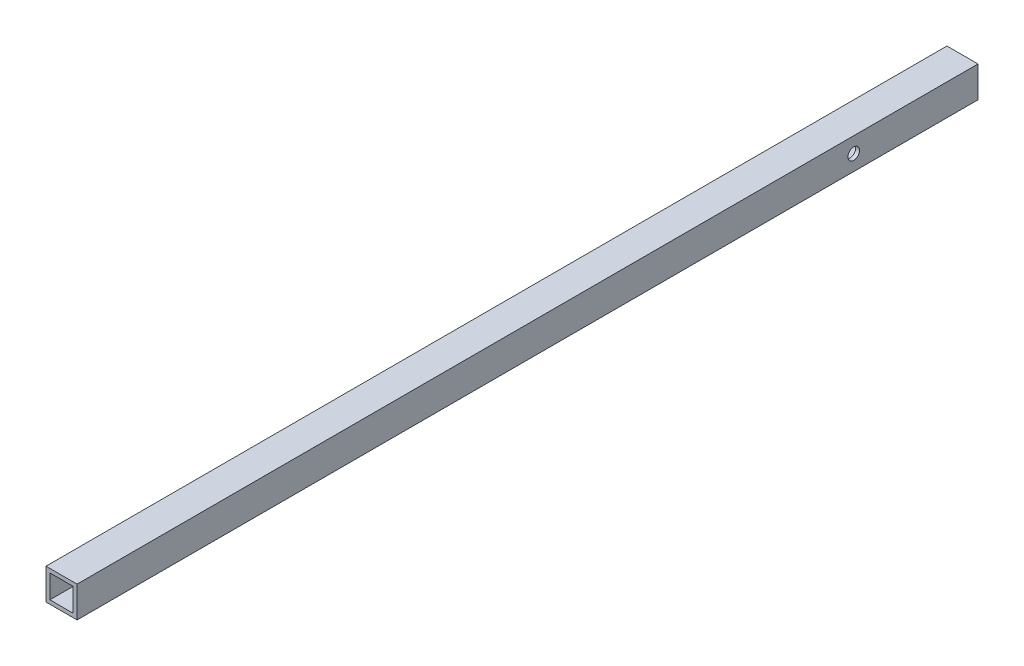
ISO-10303-21;
HEADER;
FILE_DESCRIPTION(('STEP AP214'),'2;1');
FILE_NAME('part.step','',(''),(''),'','','');
FILE_SCHEMA(('AUTOMOTIVE_DESIGN { 1 0 10303 214 1 1 1 1 }'));
ENDSEC;
DATA;
#1=APPLICATION_CONTEXT('core data for automotive mechanical design processes');
#2=APPLICATION_PROTOCOL_DEFINITION('international standard','automotive_design',2000,#1);
#3=PRODUCT_CONTEXT('',#1,'mechanical');
#4=PRODUCT('Part','Part','',(#3));
#5=PRODUCT_RELATED_PRODUCT_CATEGORY('part','',(#4));
#6=PRODUCT_DEFINITION_FORMATION('','',#4);
#7=PRODUCT_DEFINITION_CONTEXT('part definition',#1,'design');
#8=PRODUCT_DEFINITION('design','',#6,#7);
#9=PRODUCT_DEFINITION_SHAPE('','',#8);
#10=(LENGTH_UNIT() NAMED_UNIT(*) SI_UNIT(.MILLI.,.METRE.));
#11=(NAMED_UNIT(*) PLANE_ANGLE_UNIT() SI_UNIT($,.RADIAN.));
#12=(NAMED_UNIT(*) SI_UNIT($,.STERADIAN.) SOLID_ANGLE_UNIT());
#13=UNCERTAINTY_MEASURE_WITH_UNIT(LENGTH_MEASURE(1.E-05),#10,'distance_accuracy_value','');
#14=(GEOMETRIC_REPRESENTATION_CONTEXT(3) GLOBAL_UNCERTAINTY_ASSIGNED_CONTEXT((#13)) GLOBAL_UNIT_ASSIGNED_CONTEXT((#10,
#11,#12)) REPRESENTATION_CONTEXT('',''));
#15=CARTESIAN_POINT('',(0.,0.,0.));
#16=DIRECTION('',(0.,0.,1.));
#17=DIRECTION('',(1.,0.,0.));
#18=AXIS2_PLACEMENT_3D('',#15,#16,#17);
#19=CARTESIAN_POINT('',(0.,0.,736.6));
#20=DIRECTION('',(0.,0.,1.));
#21=DIRECTION('',(1.,0.,0.));
#22=AXIS2_PLACEMENT_3D('',#19,#20,#21);
#23=PLANE('',#22);
#24=DIRECTION('',(0.,-1.,0.));
#25=VECTOR('',#24,1.);
#26=CARTESIAN_POINT('',(-9.64921142042019,14.6982173962215,736.6));
#27=LINE('',#26,#25);
#28=CARTESIAN_POINT('',(-9.64921142042019,14.6982173962215,736.6));
#29=VERTEX_POINT('',#28);
#30=CARTESIAN_POINT('',(-9.64921142042019,-10.7017826037785,736.6));
#31=VERTEX_POINT('',#30);
#32=EDGE_CURVE('E137',#29,#31,#27,.T.);
#33=ORIENTED_EDGE('',*,*,#32,.T.);
#34=DIRECTION('',(1.,0.,0.));
#35=VECTOR('',#34,1.);
#36=CARTESIAN_POINT('',(-9.64921142042019,-10.7017826037785,736.6));
#37=LINE('',#36,#35);
#38=CARTESIAN_POINT('',(15.7507885795798,-10.7017826037785,736.6));
#39=VERTEX_POINT('',#38);
#40=EDGE_CURVE('E140',#31,#39,#37,.T.);
#41=ORIENTED_EDGE('',*,*,#40,.T.);
#42=DIRECTION('',(0.,1.,0.));
#43=VECTOR('',#42,1.);
#44=CARTESIAN_POINT('',(15.7507885795798,14.6982173962215,736.6));
#45=LINE('',#44,#43);
#46=CARTESIAN_POINT('',(15.7507885795798,14.6982173962215,736.6));
#47=VERTEX_POINT('',#46);
#48=EDGE_CURVE('E143',#39,#47,#45,.T.);
#49=ORIENTED_EDGE('',*,*,#48,.T.);
#50=DIRECTION('',(-1.,0.,0.));
#51=VECTOR('',#50,1.);
#52=CARTESIAN_POINT('',(-9.64921142042019,14.6982173962215,736.6));
#53=LINE('',#52,#51);
#54=EDGE_CURVE('E145',#47,#29,#53,.T.);
#55=ORIENTED_EDGE('',*,*,#54,.T.);
#56=EDGE_LOOP('',(#33,#41,#49,#55));
#57=FACE_BOUND('',#56,.T.);
#58=DIRECTION('',(1.,0.,0.));
#59=VECTOR('',#58,1.);
#60=CARTESIAN_POINT('',(-6.47421142042019,-7.52678260377854,736.6));
#61=LINE('',#60,#59);
#62=CARTESIAN_POINT('',(-6.47421142042019,-7.52678260377854,736.6));
#63=VERTEX_POINT('',#62);
#64=CARTESIAN_POINT('',(12.5757885795798,-7.52678260377854,736.6));
#65=VERTEX_POINT('',#64);
#66=EDGE_CURVE('E107',#63,#65,#61,.T.);
#67=ORIENTED_EDGE('',*,*,#66,.F.);
#68=DIRECTION('',(0.,-1.,0.));
#69=VECTOR('',#68,1.);
#70=CARTESIAN_POINT('',(-6.47421142042019,11.5232173962215,736.6));
#71=LINE('',#70,#69);
#72=CARTESIAN_POINT('',(-6.47421142042019,11.5232173962215,736.6));
#73=VERTEX_POINT('',#72);
#74=EDGE_CURVE('E99',#73,#63,#71,.T.);
#75=ORIENTED_EDGE('',*,*,#74,.F.);
#76=DIRECTION('',(-1.,0.,0.));
#77=VECTOR('',#76,1.);
#78=CARTESIAN_POINT('',(-6.47421142042019,11.5232173962215,736.6));
#79=LINE('',#78,#77);
#80=CARTESIAN_POINT('',(12.5757885795798,11.5232173962215,736.6));
#81=VERTEX_POINT('',#80);
#82=EDGE_CURVE('E121',#81,#73,#79,.T.);
#83=ORIENTED_EDGE('',*,*,#82,.F.);
#84=DIRECTION('',(0.,1.,0.));
#85=VECTOR('',#84,1.);
#86=CARTESIAN_POINT('',(12.5757885795798,11.5232173962215,736.6));
#87=LINE('',#86,#85);
#88=EDGE_CURVE('E119',#65,#81,#87,.T.);
#89=ORIENTED_EDGE('',*,*,#88,.F.);
#90=EDGE_LOOP('',(#67,#75,#83,#89));
#91=FACE_BOUND('',#90,.T.);
#92=ADVANCED_FACE('F33',(#57,#91),#23,.T.);
#93=CARTESIAN_POINT('',(0.,0.,0.));
#94=DIRECTION('',(0.,0.,1.));
#95=DIRECTION('',(1.,0.,0.));
#96=AXIS2_PLACEMENT_3D('',#93,#94,#95);
#97=PLANE('',#96);
#98=DIRECTION('',(0.,-1.,0.));
#99=VECTOR('',#98,1.);
#100=CARTESIAN_POINT('',(-9.64921142042019,14.6982173962215,0.));
#101=LINE('',#100,#99);
#102=CARTESIAN_POINT('',(-9.64921142042019,14.6982173962215,0.));
#103=VERTEX_POINT('',#102);
#104=CARTESIAN_POINT('',(-9.64921142042019,-10.7017826037785,0.));
#105=VERTEX_POINT('',#104);
#106=EDGE_CURVE('E115',#103,#105,#101,.T.);
#107=ORIENTED_EDGE('',*,*,#106,.F.);
#108=DIRECTION('',(-1.,0.,0.));
#109=VECTOR('',#108,1.);
#110=CARTESIAN_POINT('',(-9.64921142042019,14.6982173962215,0.));
#111=LINE('',#110,#109);
#112=CARTESIAN_POINT('',(15.7507885795798,14.6982173962215,0.));
#113=VERTEX_POINT('',#112);
#114=EDGE_CURVE('E141',#113,#103,#111,.T.);
#115=ORIENTED_EDGE('',*,*,#114,.F.);
#116=DIRECTION('',(0.,1.,0.));
#117=VECTOR('',#116,1.);
#118=CARTESIAN_POINT('',(15.7507885795798,14.6982173962215,0.));
#119=LINE('',#118,#117);
#120=CARTESIAN_POINT('',(15.7507885795798,-10.7017826037785,0.));
#121=VERTEX_POINT('',#120);
#122=EDGE_CURVE('E152',#121,#113,#119,.T.);
#123=ORIENTED_EDGE('',*,*,#122,.F.);
#124=DIRECTION('',(1.,0.,0.));
#125=VECTOR('',#124,1.);
#126=CARTESIAN_POINT('',(-9.64921142042019,-10.7017826037785,0.));
#127=LINE('',#126,#125);
#128=EDGE_CURVE('E150',#105,#121,#127,.T.);
#129=ORIENTED_EDGE('',*,*,#128,.F.);
#130=EDGE_LOOP('',(#107,#115,#123,#129));
#131=FACE_BOUND('',#130,.T.);
#132=DIRECTION('',(0.,-1.,0.));
#133=VECTOR('',#132,1.);
#134=CARTESIAN_POINT('',(-6.47421142042019,11.5232173962215,0.));
#135=LINE('',#134,#133);
#136=CARTESIAN_POINT('',(-6.47421142042019,11.5232173962215,0.));
#137=VERTEX_POINT('',#136);
#138=CARTESIAN_POINT('',(-6.47421142042019,-7.52678260377854,0.));
#139=VERTEX_POINT('',#138);
#140=EDGE_CURVE('E57',#137,#139,#135,.T.);
#141=ORIENTED_EDGE('',*,*,#140,.T.);
#142=DIRECTION('',(1.,0.,0.));
#143=VECTOR('',#142,1.);
#144=CARTESIAN_POINT('',(-6.47421142042019,-7.52678260377854,0.));
#145=LINE('',#144,#143);
#146=CARTESIAN_POINT('',(12.5757885795798,-7.52678260377854,0.));
#147=VERTEX_POINT('',#146);
#148=EDGE_CURVE('E114',#139,#147,#145,.T.);
#149=ORIENTED_EDGE('',*,*,#148,.T.);
#150=DIRECTION('',(0.,1.,0.));
#151=VECTOR('',#150,1.);
#152=CARTESIAN_POINT('',(12.5757885795798,11.5232173962215,0.));
#153=LINE('',#152,#151);
#154=CARTESIAN_POINT('',(12.5757885795798,11.5232173962215,0.));
#155=VERTEX_POINT('',#154);
#156=EDGE_CURVE('E129',#147,#155,#153,.T.);
#157=ORIENTED_EDGE('',*,*,#156,.T.);
#158=DIRECTION('',(-1.,0.,0.));
#159=VECTOR('',#158,1.);
#160=CARTESIAN_POINT('',(-6.47421142042019,11.5232173962215,0.));
#161=LINE('',#160,#159);
#162=EDGE_CURVE('E108',#155,#137,#161,.T.);
#163=ORIENTED_EDGE('',*,*,#162,.T.);
#164=EDGE_LOOP('',(#141,#149,#157,#163));
#165=FACE_BOUND('',#164,.T.);
#166=ADVANCED_FACE('F171',(#131,#165),#97,.F.);
#167=CARTESIAN_POINT('',(-9.64921142042019,14.6982173962215,736.6));
#168=DIRECTION('',(1.,0.,0.));
#169=DIRECTION('',(0.,0.,-1.));
#170=AXIS2_PLACEMENT_3D('',#167,#168,#169);
#171=PLANE('',#170);
#172=CARTESIAN_POINT('',(-9.64921142042019,1.99821739622146,101.6));
#173=DIRECTION('',(-1.,0.,0.));
#174=DIRECTION('',(0.,0.,1.));
#175=AXIS2_PLACEMENT_3D('',#172,#173,#174);
#176=CIRCLE('',#175,4.7625);
#177=CARTESIAN_POINT('',(-9.64921142042019,1.99821739622146,106.3625));
#178=VERTEX_POINT('',#177);
#179=EDGE_CURVE('E215',#178,#178,#176,.T.);
#180=ORIENTED_EDGE('',*,*,#179,.F.);
#181=EDGE_LOOP('',(#180));
#182=FACE_BOUND('',#181,.T.);
#183=ORIENTED_EDGE('',*,*,#106,.T.);
#184=DIRECTION('',(0.,0.,-1.));
#185=VECTOR('',#184,1.);
#186=CARTESIAN_POINT('',(-9.64921142042019,-10.7017826037785,736.6));
#187=LINE('',#186,#185);
#188=EDGE_CURVE('E11',#31,#105,#187,.T.);
#189=ORIENTED_EDGE('',*,*,#188,.F.);
#190=ORIENTED_EDGE('',*,*,#32,.F.);
#191=DIRECTION('',(0.,0.,-1.));
#192=VECTOR('',#191,1.);
#193=CARTESIAN_POINT('',(-9.64921142042019,14.6982173962215,736.6));
#194=LINE('',#193,#192);
#195=EDGE_CURVE('E147',#29,#103,#194,.T.);
#196=ORIENTED_EDGE('',*,*,#195,.T.);
#197=EDGE_LOOP('',(#183,#189,#190,#196));
#198=FACE_BOUND('',#197,.T.);
#199=ADVANCED_FACE('F35',(#182,#198),#171,.F.);
#200=CARTESIAN_POINT('',(-9.64921142042019,-10.7017826037785,736.6));
#201=DIRECTION('',(0.,1.,0.));
#202=DIRECTION('',(0.,0.,1.));
#203=AXIS2_PLACEMENT_3D('',#200,#201,#202);
#204=PLANE('',#203);
#205=ORIENTED_EDGE('',*,*,#128,.T.);
#206=DIRECTION('',(0.,0.,-1.));
#207=VECTOR('',#206,1.);
#208=CARTESIAN_POINT('',(15.7507885795798,-10.7017826037785,736.6));
#209=LINE('',#208,#207);
#210=EDGE_CURVE('E42',#39,#121,#209,.T.);
#211=ORIENTED_EDGE('',*,*,#210,.F.);
#212=ORIENTED_EDGE('',*,*,#40,.F.);
#213=ORIENTED_EDGE('',*,*,#188,.T.);
#214=EDGE_LOOP('',(#205,#211,#212,#213));
#215=FACE_BOUND('',#214,.T.);
#216=ADVANCED_FACE('F181',(#215),#204,.F.);
#217=CARTESIAN_POINT('',(15.7507885795798,14.6982173962215,736.6));
#218=DIRECTION('',(-1.,0.,0.));
#219=DIRECTION('',(0.,-1.,0.));
#220=AXIS2_PLACEMENT_3D('',#217,#218,#219);
#221=PLANE('',#220);
#222=CARTESIAN_POINT('',(15.7507885795798,1.99821739622146,101.6));
#223=DIRECTION('',(-1.,0.,0.));
#224=DIRECTION('',(0.,-1.,0.));
#225=AXIS2_PLACEMENT_3D('',#222,#223,#224);
#226=CIRCLE('',#225,4.7625);
#227=CARTESIAN_POINT('',(15.7507885795798,-2.76428260377854,101.6));
#228=VERTEX_POINT('',#227);
#229=EDGE_CURVE('E127',#228,#228,#226,.T.);
#230=ORIENTED_EDGE('',*,*,#229,.T.);
#231=EDGE_LOOP('',(#230));
#232=FACE_BOUND('',#231,.T.);
#233=ORIENTED_EDGE('',*,*,#122,.T.);
#234=DIRECTION('',(0.,0.,-1.));
#235=VECTOR('',#234,1.);
#236=CARTESIAN_POINT('',(15.7507885795798,14.6982173962215,736.6));
#237=LINE('',#236,#235);
#238=EDGE_CURVE('E157',#47,#113,#237,.T.);
#239=ORIENTED_EDGE('',*,*,#238,.F.);
#240=ORIENTED_EDGE('',*,*,#48,.F.);
#241=ORIENTED_EDGE('',*,*,#210,.T.);
#242=EDGE_LOOP('',(#233,#239,#240,#241));
#243=FACE_BOUND('',#242,.T.);
#244=ADVANCED_FACE('F165',(#232,#243),#221,.F.);
#245=CARTESIAN_POINT('',(-9.64921142042019,14.6982173962215,736.6));
#246=DIRECTION('',(0.,-1.,0.));
#247=DIRECTION('',(0.,0.,-1.));
#248=AXIS2_PLACEMENT_3D('',#245,#246,#247);
#249=PLANE('',#248);
#250=ORIENTED_EDGE('',*,*,#114,.T.);
#251=ORIENTED_EDGE('',*,*,#195,.F.);
#252=ORIENTED_EDGE('',*,*,#54,.F.);
#253=ORIENTED_EDGE('',*,*,#238,.T.);
#254=EDGE_LOOP('',(#250,#251,#252,#253));
#255=FACE_BOUND('',#254,.T.);
#256=ADVANCED_FACE('F175',(#255),#249,.F.);
#257=CARTESIAN_POINT('',(-6.47421142042019,11.5232173962215,736.6));
#258=DIRECTION('',(1.,0.,0.));
#259=DIRECTION('',(0.,1.,0.));
#260=AXIS2_PLACEMENT_3D('',#257,#258,#259);
#261=PLANE('',#260);
#262=CARTESIAN_POINT('',(-6.47421142042019,1.99821739622146,101.6));
#263=DIRECTION('',(1.,0.,0.));
#264=DIRECTION('',(0.,1.,0.));
#265=AXIS2_PLACEMENT_3D('',#262,#263,#264);
#266=CIRCLE('',#265,4.7625);
#267=CARTESIAN_POINT('',(-6.47421142042019,6.76071739622146,101.6));
#268=VERTEX_POINT('',#267);
#269=EDGE_CURVE('E210',#268,#268,#266,.T.);
#270=ORIENTED_EDGE('',*,*,#269,.F.);
#271=EDGE_LOOP('',(#270));
#272=FACE_BOUND('',#271,.T.);
#273=ORIENTED_EDGE('',*,*,#140,.F.);
#274=DIRECTION('',(0.,0.,-1.));
#275=VECTOR('',#274,1.);
#276=CARTESIAN_POINT('',(-6.47421142042019,11.5232173962215,736.6));
#277=LINE('',#276,#275);
#278=EDGE_CURVE('E103',#73,#137,#277,.T.);
#279=ORIENTED_EDGE('',*,*,#278,.F.);
#280=ORIENTED_EDGE('',*,*,#74,.T.);
#281=DIRECTION('',(0.,0.,-1.));
#282=VECTOR('',#281,1.);
#283=CARTESIAN_POINT('',(-6.47421142042019,-7.52678260377854,736.6));
#284=LINE('',#283,#282);
#285=EDGE_CURVE('E102',#63,#139,#284,.T.);
#286=ORIENTED_EDGE('',*,*,#285,.T.);
#287=EDGE_LOOP('',(#273,#279,#280,#286));
#288=FACE_BOUND('',#287,.T.);
#289=ADVANCED_FACE('F101',(#272,#288),#261,.T.);
#290=CARTESIAN_POINT('',(-6.47421142042019,-7.52678260377854,736.6));
#291=DIRECTION('',(0.,1.,0.));
#292=DIRECTION('',(-1.,0.,0.));
#293=AXIS2_PLACEMENT_3D('',#290,#291,#292);
#294=PLANE('',#293);
#295=ORIENTED_EDGE('',*,*,#148,.F.);
#296=ORIENTED_EDGE('',*,*,#285,.F.);
#297=ORIENTED_EDGE('',*,*,#66,.T.);
#298=DIRECTION('',(0.,0.,-1.));
#299=VECTOR('',#298,1.);
#300=CARTESIAN_POINT('',(12.5757885795798,-7.52678260377854,736.6));
#301=LINE('',#300,#299);
#302=EDGE_CURVE('E116',#65,#147,#301,.T.);
#303=ORIENTED_EDGE('',*,*,#302,.T.);
#304=EDGE_LOOP('',(#295,#296,#297,#303));
#305=FACE_BOUND('',#304,.T.);
#306=ADVANCED_FACE('F111',(#305),#294,.T.);
#307=CARTESIAN_POINT('',(12.5757885795798,11.5232173962215,736.6));
#308=DIRECTION('',(-1.,0.,0.));
#309=DIRECTION('',(0.,-1.,0.));
#310=AXIS2_PLACEMENT_3D('',#307,#308,#309);
#311=PLANE('',#310);
#312=CARTESIAN_POINT('',(12.5757885795798,1.99821739622146,101.6));
#313=DIRECTION('',(-1.,0.,0.));
#314=DIRECTION('',(0.,-1.,0.));
#315=AXIS2_PLACEMENT_3D('',#312,#313,#314);
#316=CIRCLE('',#315,4.7625);
#317=CARTESIAN_POINT('',(12.5757885795798,-2.76428260377854,101.6));
#318=VERTEX_POINT('',#317);
#319=EDGE_CURVE('E37',#318,#318,#316,.T.);
#320=ORIENTED_EDGE('',*,*,#319,.F.);
#321=EDGE_LOOP('',(#320));
#322=FACE_BOUND('',#321,.T.);
#323=ORIENTED_EDGE('',*,*,#156,.F.);
#324=ORIENTED_EDGE('',*,*,#302,.F.);
#325=ORIENTED_EDGE('',*,*,#88,.T.);
#326=DIRECTION('',(0.,0.,-1.));
#327=VECTOR('',#326,1.);
#328=CARTESIAN_POINT('',(12.5757885795798,11.5232173962215,736.6));
#329=LINE('',#328,#327);
#330=EDGE_CURVE('E49',#81,#155,#329,.T.);
#331=ORIENTED_EDGE('',*,*,#330,.T.);
#332=EDGE_LOOP('',(#323,#324,#325,#331));
#333=FACE_BOUND('',#332,.T.);
#334=ADVANCED_FACE('F207',(#322,#333),#311,.T.);
#335=CARTESIAN_POINT('',(-6.47421142042019,11.5232173962215,736.6));
#336=DIRECTION('',(0.,-1.,0.));
#337=DIRECTION('',(0.,0.,-1.));
#338=AXIS2_PLACEMENT_3D('',#335,#336,#337);
#339=PLANE('',#338);
#340=ORIENTED_EDGE('',*,*,#162,.F.);
#341=ORIENTED_EDGE('',*,*,#330,.F.);
#342=ORIENTED_EDGE('',*,*,#82,.T.);
#343=ORIENTED_EDGE('',*,*,#278,.T.);
#344=EDGE_LOOP('',(#340,#341,#342,#343));
#345=FACE_BOUND('',#344,.T.);
#346=ADVANCED_FACE('F227',(#345),#339,.T.);
#347=CARTESIAN_POINT('',(117.35078857958,1.99821739622146,101.6));
#348=DIRECTION('',(-1.,0.,0.));
#349=DIRECTION('',(0.,0.,1.));
#350=AXIS2_PLACEMENT_3D('',#347,#348,#349);
#351=CYLINDRICAL_SURFACE('',#350,4.7625);
#352=ORIENTED_EDGE('',*,*,#319,.T.);
#353=EDGE_LOOP('',(#352));
#354=FACE_BOUND('',#353,.T.);
#355=ORIENTED_EDGE('',*,*,#229,.F.);
#356=EDGE_LOOP('',(#355));
#357=FACE_BOUND('',#356,.T.);
#358=ADVANCED_FACE('F222',(#354,#357),#351,.F.);
#359=ORIENTED_EDGE('',*,*,#269,.T.);
#360=EDGE_LOOP('',(#359));
#361=FACE_BOUND('',#360,.T.);
#362=ORIENTED_EDGE('',*,*,#179,.T.);
#363=EDGE_LOOP('',(#362));
#364=FACE_BOUND('',#363,.T.);
#365=ADVANCED_FACE('F220',(#361,#364),#351,.F.);
#366=CLOSED_SHELL('',(#92,#166,#199,#216,#244,#256,#289,#306,#334,#346,#358,#365));
#367=MANIFOLD_SOLID_BREP('B2',#366);
#368=ADVANCED_BREP_SHAPE_REPRESENTATION('',(#18,#367),#14);
#369=SHAPE_DEFINITION_REPRESENTATION(#9,#368);
ENDSEC;
END-ISO-10303-21;
